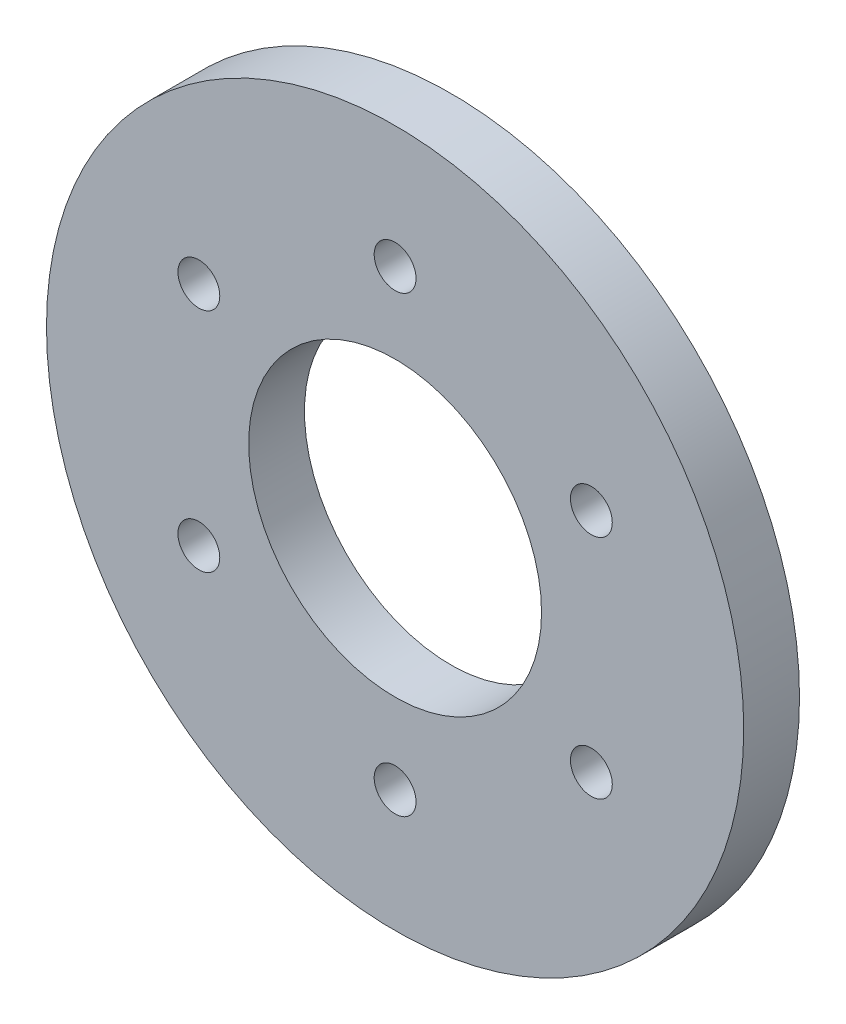
ISO-10303-21;
HEADER;
FILE_DESCRIPTION(('STEP AP214'),'2;1');
FILE_NAME('part.step','',(''),(''),'','','');
FILE_SCHEMA(('AUTOMOTIVE_DESIGN { 1 0 10303 214 1 1 1 1 }'));
ENDSEC;
DATA;
#1=APPLICATION_CONTEXT('core data for automotive mechanical design processes');
#2=APPLICATION_PROTOCOL_DEFINITION('international standard','automotive_design',2000,#1);
#3=PRODUCT_CONTEXT('',#1,'mechanical');
#4=PRODUCT('Part','Part','',(#3));
#5=PRODUCT_RELATED_PRODUCT_CATEGORY('part','',(#4));
#6=PRODUCT_DEFINITION_FORMATION('','',#4);
#7=PRODUCT_DEFINITION_CONTEXT('part definition',#1,'design');
#8=PRODUCT_DEFINITION('design','',#6,#7);
#9=PRODUCT_DEFINITION_SHAPE('','',#8);
#10=(LENGTH_UNIT() NAMED_UNIT(*) SI_UNIT(.MILLI.,.METRE.));
#11=(NAMED_UNIT(*) PLANE_ANGLE_UNIT() SI_UNIT($,.RADIAN.));
#12=(NAMED_UNIT(*) SI_UNIT($,.STERADIAN.) SOLID_ANGLE_UNIT());
#13=UNCERTAINTY_MEASURE_WITH_UNIT(LENGTH_MEASURE(1.E-05),#10,'distance_accuracy_value','');
#14=(GEOMETRIC_REPRESENTATION_CONTEXT(3) GLOBAL_UNCERTAINTY_ASSIGNED_CONTEXT((#13)) GLOBAL_UNIT_ASSIGNED_CONTEXT((#10,
#11,#12)) REPRESENTATION_CONTEXT('',''));
#15=CARTESIAN_POINT('',(0.,0.,0.));
#16=DIRECTION('',(0.,0.,1.));
#17=DIRECTION('',(1.,0.,0.));
#18=AXIS2_PLACEMENT_3D('',#15,#16,#17);
#19=CARTESIAN_POINT('',(-80.8551645809938,39.5101937964285,-40.9999899999918));
#20=DIRECTION('',(0.,0.,1.));
#21=DIRECTION('',(1.,0.,0.));
#22=AXIS2_PLACEMENT_3D('',#19,#20,#21);
#23=PLANE('',#22);
#24=CARTESIAN_POINT('',(-109.000990203987,23.260193796428,-40.9999899999918));
#25=DIRECTION('',(0.,0.,1.));
#26=DIRECTION('',(1.,0.,0.));
#27=AXIS2_PLACEMENT_3D('',#24,#25,#26);
#28=CIRCLE('',#27,3.00000000000001);
#29=CARTESIAN_POINT('',(-106.000990203987,23.260193796428,-40.9999899999918));
#30=VERTEX_POINT('',#29);
#31=EDGE_CURVE('E71',#30,#30,#28,.T.);
#32=ORIENTED_EDGE('',*,*,#31,.F.);
#33=EDGE_LOOP('',(#32));
#34=FACE_BOUND('',#33,.T.);
#35=CARTESIAN_POINT('',(-52.7093389579982,23.2601937964292,-40.9999899999918));
#36=DIRECTION('',(0.,0.,1.));
#37=DIRECTION('',(1.,0.,0.));
#38=AXIS2_PLACEMENT_3D('',#35,#36,#37);
#39=CIRCLE('',#38,3.);
#40=CARTESIAN_POINT('',(-49.7093389579982,23.2601937964292,-40.9999899999918));
#41=VERTEX_POINT('',#40);
#42=EDGE_CURVE('E59',#41,#41,#39,.T.);
#43=ORIENTED_EDGE('',*,*,#42,.F.);
#44=EDGE_LOOP('',(#43));
#45=FACE_BOUND('',#44,.T.);
#46=CARTESIAN_POINT('',(-80.8551645809938,72.0101937964285,-40.9999899999918));
#47=DIRECTION('',(0.,0.,1.));
#48=DIRECTION('',(1.,0.,0.));
#49=AXIS2_PLACEMENT_3D('',#46,#47,#48);
#50=CIRCLE('',#49,3.00000000000001);
#51=CARTESIAN_POINT('',(-77.8551645809938,72.0101937964285,-40.9999899999918));
#52=VERTEX_POINT('',#51);
#53=EDGE_CURVE('E47',#52,#52,#50,.T.);
#54=ORIENTED_EDGE('',*,*,#53,.F.);
#55=EDGE_LOOP('',(#54));
#56=FACE_BOUND('',#55,.T.);
#57=CARTESIAN_POINT('',(-80.8551645809938,39.5101937964285,-40.9999899999918));
#58=DIRECTION('',(0.,0.,1.));
#59=DIRECTION('',(1.,0.,0.));
#60=AXIS2_PLACEMENT_3D('',#57,#58,#59);
#61=CIRCLE('',#60,50.);
#62=CARTESIAN_POINT('',(-30.8551645809938,39.5101937964285,-40.9999899999918));
#63=VERTEX_POINT('',#62);
#64=EDGE_CURVE('E10',#63,#63,#61,.T.);
#65=ORIENTED_EDGE('',*,*,#64,.T.);
#66=EDGE_LOOP('',(#65));
#67=FACE_BOUND('',#66,.T.);
#68=CARTESIAN_POINT('',(-80.8551645809938,39.5101937964285,-40.9999899999918));
#69=DIRECTION('',(0.,0.,1.));
#70=DIRECTION('',(1.,0.,0.));
#71=AXIS2_PLACEMENT_3D('',#68,#69,#70);
#72=CIRCLE('',#71,20.9999999999854);
#73=CARTESIAN_POINT('',(-59.8551645810084,39.5101937964285,-40.9999899999918));
#74=VERTEX_POINT('',#73);
#75=EDGE_CURVE('E42',#74,#74,#72,.T.);
#76=ORIENTED_EDGE('',*,*,#75,.F.);
#77=EDGE_LOOP('',(#76));
#78=FACE_BOUND('',#77,.T.);
#79=CARTESIAN_POINT('',(-52.709338957999,55.7601937964292,-40.9999899999918));
#80=DIRECTION('',(0.,0.,1.));
#81=DIRECTION('',(1.,0.,0.));
#82=AXIS2_PLACEMENT_3D('',#79,#80,#81);
#83=CIRCLE('',#82,3.);
#84=CARTESIAN_POINT('',(-49.709338957999,55.7601937964292,-40.9999899999918));
#85=VERTEX_POINT('',#84);
#86=EDGE_CURVE('E53',#85,#85,#83,.T.);
#87=ORIENTED_EDGE('',*,*,#86,.F.);
#88=EDGE_LOOP('',(#87));
#89=FACE_BOUND('',#88,.T.);
#90=CARTESIAN_POINT('',(-80.8551645809922,7.0101937964285,-40.9999899999918));
#91=DIRECTION('',(0.,0.,1.));
#92=DIRECTION('',(1.,0.,0.));
#93=AXIS2_PLACEMENT_3D('',#90,#91,#92);
#94=CIRCLE('',#93,3.00000000000001);
#95=CARTESIAN_POINT('',(-77.8551645809922,7.0101937964285,-40.9999899999918));
#96=VERTEX_POINT('',#95);
#97=EDGE_CURVE('E65',#96,#96,#94,.T.);
#98=ORIENTED_EDGE('',*,*,#97,.F.);
#99=EDGE_LOOP('',(#98));
#100=FACE_BOUND('',#99,.T.);
#101=CARTESIAN_POINT('',(-109.000990203987,55.7601937964281,-40.9999899999918));
#102=DIRECTION('',(0.,0.,1.));
#103=DIRECTION('',(1.,0.,0.));
#104=AXIS2_PLACEMENT_3D('',#101,#102,#103);
#105=CIRCLE('',#104,3.00000000000001);
#106=CARTESIAN_POINT('',(-106.000990203987,55.7601937964281,-40.9999899999918));
#107=VERTEX_POINT('',#106);
#108=EDGE_CURVE('E77',#107,#107,#105,.T.);
#109=ORIENTED_EDGE('',*,*,#108,.F.);
#110=EDGE_LOOP('',(#109));
#111=FACE_BOUND('',#110,.T.);
#112=ADVANCED_FACE('F31',(#34,#45,#56,#67,#78,#89,#100,#111),#23,.T.);
#113=CARTESIAN_POINT('',(-80.8551645809938,39.5101937964285,-48.9999899999918));
#114=DIRECTION('',(0.,0.,1.));
#115=DIRECTION('',(1.,0.,0.));
#116=AXIS2_PLACEMENT_3D('',#113,#114,#115);
#117=PLANE('',#116);
#118=CARTESIAN_POINT('',(-80.8551645809938,39.5101937964285,-48.9999899999918));
#119=DIRECTION('',(0.,0.,1.));
#120=DIRECTION('',(1.,0.,0.));
#121=AXIS2_PLACEMENT_3D('',#118,#119,#120);
#122=CIRCLE('',#121,50.);
#123=CARTESIAN_POINT('',(-30.8551645809938,39.5101937964285,-48.9999899999918));
#124=VERTEX_POINT('',#123);
#125=EDGE_CURVE('E35',#124,#124,#122,.T.);
#126=ORIENTED_EDGE('',*,*,#125,.F.);
#127=EDGE_LOOP('',(#126));
#128=FACE_BOUND('',#127,.T.);
#129=CARTESIAN_POINT('',(-80.8551645809938,39.5101937964285,-48.9999899999918));
#130=DIRECTION('',(0.,0.,1.));
#131=DIRECTION('',(1.,0.,0.));
#132=AXIS2_PLACEMENT_3D('',#129,#130,#131);
#133=CIRCLE('',#132,20.9999999999854);
#134=CARTESIAN_POINT('',(-59.8551645810084,39.5101937964285,-48.9999899999918));
#135=VERTEX_POINT('',#134);
#136=EDGE_CURVE('E44',#135,#135,#133,.T.);
#137=ORIENTED_EDGE('',*,*,#136,.T.);
#138=EDGE_LOOP('',(#137));
#139=FACE_BOUND('',#138,.T.);
#140=CARTESIAN_POINT('',(-80.8551645809938,72.0101937964285,-48.9999899999918));
#141=DIRECTION('',(0.,0.,1.));
#142=DIRECTION('',(1.,0.,0.));
#143=AXIS2_PLACEMENT_3D('',#140,#141,#142);
#144=CIRCLE('',#143,3.00000000000001);
#145=CARTESIAN_POINT('',(-77.8551645809938,72.0101937964285,-48.9999899999918));
#146=VERTEX_POINT('',#145);
#147=EDGE_CURVE('E50',#146,#146,#144,.T.);
#148=ORIENTED_EDGE('',*,*,#147,.T.);
#149=EDGE_LOOP('',(#148));
#150=FACE_BOUND('',#149,.T.);
#151=CARTESIAN_POINT('',(-52.709338957999,55.7601937964292,-48.9999899999918));
#152=DIRECTION('',(0.,0.,1.));
#153=DIRECTION('',(1.,0.,0.));
#154=AXIS2_PLACEMENT_3D('',#151,#152,#153);
#155=CIRCLE('',#154,3.);
#156=CARTESIAN_POINT('',(-49.709338957999,55.7601937964292,-48.9999899999918));
#157=VERTEX_POINT('',#156);
#158=EDGE_CURVE('E56',#157,#157,#155,.T.);
#159=ORIENTED_EDGE('',*,*,#158,.T.);
#160=EDGE_LOOP('',(#159));
#161=FACE_BOUND('',#160,.T.);
#162=CARTESIAN_POINT('',(-52.7093389579982,23.2601937964292,-48.9999899999918));
#163=DIRECTION('',(0.,0.,1.));
#164=DIRECTION('',(1.,0.,0.));
#165=AXIS2_PLACEMENT_3D('',#162,#163,#164);
#166=CIRCLE('',#165,3.);
#167=CARTESIAN_POINT('',(-49.7093389579982,23.2601937964292,-48.9999899999918));
#168=VERTEX_POINT('',#167);
#169=EDGE_CURVE('E62',#168,#168,#166,.T.);
#170=ORIENTED_EDGE('',*,*,#169,.T.);
#171=EDGE_LOOP('',(#170));
#172=FACE_BOUND('',#171,.T.);
#173=CARTESIAN_POINT('',(-80.8551645809922,7.0101937964285,-48.9999899999918));
#174=DIRECTION('',(0.,0.,1.));
#175=DIRECTION('',(1.,0.,0.));
#176=AXIS2_PLACEMENT_3D('',#173,#174,#175);
#177=CIRCLE('',#176,3.00000000000001);
#178=CARTESIAN_POINT('',(-77.8551645809922,7.0101937964285,-48.9999899999918));
#179=VERTEX_POINT('',#178);
#180=EDGE_CURVE('E68',#179,#179,#177,.T.);
#181=ORIENTED_EDGE('',*,*,#180,.T.);
#182=EDGE_LOOP('',(#181));
#183=FACE_BOUND('',#182,.T.);
#184=CARTESIAN_POINT('',(-109.000990203987,23.260193796428,-48.9999899999918));
#185=DIRECTION('',(0.,0.,1.));
#186=DIRECTION('',(1.,0.,0.));
#187=AXIS2_PLACEMENT_3D('',#184,#185,#186);
#188=CIRCLE('',#187,3.00000000000001);
#189=CARTESIAN_POINT('',(-106.000990203987,23.260193796428,-48.9999899999918));
#190=VERTEX_POINT('',#189);
#191=EDGE_CURVE('E74',#190,#190,#188,.T.);
#192=ORIENTED_EDGE('',*,*,#191,.T.);
#193=EDGE_LOOP('',(#192));
#194=FACE_BOUND('',#193,.T.);
#195=CARTESIAN_POINT('',(-109.000990203987,55.7601937964281,-48.9999899999918));
#196=DIRECTION('',(0.,0.,1.));
#197=DIRECTION('',(1.,0.,0.));
#198=AXIS2_PLACEMENT_3D('',#195,#196,#197);
#199=CIRCLE('',#198,3.00000000000001);
#200=CARTESIAN_POINT('',(-106.000990203987,55.7601937964281,-48.9999899999918));
#201=VERTEX_POINT('',#200);
#202=EDGE_CURVE('E80',#201,#201,#199,.T.);
#203=ORIENTED_EDGE('',*,*,#202,.T.);
#204=EDGE_LOOP('',(#203));
#205=FACE_BOUND('',#204,.T.);
#206=ADVANCED_FACE('F90',(#128,#139,#150,#161,#172,#183,#194,#205),#117,.F.);
#207=CARTESIAN_POINT('',(-80.8551645809938,39.5101937964285,-40.9999899999918));
#208=DIRECTION('',(0.,0.,-1.));
#209=DIRECTION('',(-1.,0.,0.));
#210=AXIS2_PLACEMENT_3D('',#207,#208,#209);
#211=CYLINDRICAL_SURFACE('',#210,50.);
#212=ORIENTED_EDGE('',*,*,#64,.F.);
#213=EDGE_LOOP('',(#212));
#214=FACE_BOUND('',#213,.T.);
#215=ORIENTED_EDGE('',*,*,#125,.T.);
#216=EDGE_LOOP('',(#215));
#217=FACE_BOUND('',#216,.T.);
#218=ADVANCED_FACE('F33',(#214,#217),#211,.T.);
#219=CARTESIAN_POINT('',(-80.8551645809938,39.5101937964285,-40.9999899999918));
#220=DIRECTION('',(0.,0.,-1.));
#221=DIRECTION('',(-1.,0.,0.));
#222=AXIS2_PLACEMENT_3D('',#219,#220,#221);
#223=CYLINDRICAL_SURFACE('',#222,20.9999999999854);
#224=ORIENTED_EDGE('',*,*,#75,.T.);
#225=EDGE_LOOP('',(#224));
#226=FACE_BOUND('',#225,.T.);
#227=ORIENTED_EDGE('',*,*,#136,.F.);
#228=EDGE_LOOP('',(#227));
#229=FACE_BOUND('',#228,.T.);
#230=ADVANCED_FACE('F100',(#226,#229),#223,.F.);
#231=CARTESIAN_POINT('',(-80.8551645809938,72.0101937964285,-40.9999899999918));
#232=DIRECTION('',(0.,0.,-1.));
#233=DIRECTION('',(-1.,0.,0.));
#234=AXIS2_PLACEMENT_3D('',#231,#232,#233);
#235=CYLINDRICAL_SURFACE('',#234,3.00000000000001);
#236=ORIENTED_EDGE('',*,*,#53,.T.);
#237=EDGE_LOOP('',(#236));
#238=FACE_BOUND('',#237,.T.);
#239=ORIENTED_EDGE('',*,*,#147,.F.);
#240=EDGE_LOOP('',(#239));
#241=FACE_BOUND('',#240,.T.);
#242=ADVANCED_FACE('F103',(#238,#241),#235,.F.);
#243=CARTESIAN_POINT('',(-52.709338957999,55.7601937964292,-40.9999899999918));
#244=DIRECTION('',(0.,0.,-1.));
#245=DIRECTION('',(-1.,0.,0.));
#246=AXIS2_PLACEMENT_3D('',#243,#244,#245);
#247=CYLINDRICAL_SURFACE('',#246,3.);
#248=ORIENTED_EDGE('',*,*,#86,.T.);
#249=EDGE_LOOP('',(#248));
#250=FACE_BOUND('',#249,.T.);
#251=ORIENTED_EDGE('',*,*,#158,.F.);
#252=EDGE_LOOP('',(#251));
#253=FACE_BOUND('',#252,.T.);
#254=ADVANCED_FACE('F107',(#250,#253),#247,.F.);
#255=CARTESIAN_POINT('',(-52.7093389579982,23.2601937964292,-40.9999899999918));
#256=DIRECTION('',(0.,0.,-1.));
#257=DIRECTION('',(-1.,0.,0.));
#258=AXIS2_PLACEMENT_3D('',#255,#256,#257);
#259=CYLINDRICAL_SURFACE('',#258,3.);
#260=ORIENTED_EDGE('',*,*,#42,.T.);
#261=EDGE_LOOP('',(#260));
#262=FACE_BOUND('',#261,.T.);
#263=ORIENTED_EDGE('',*,*,#169,.F.);
#264=EDGE_LOOP('',(#263));
#265=FACE_BOUND('',#264,.T.);
#266=ADVANCED_FACE('F111',(#262,#265),#259,.F.);
#267=CARTESIAN_POINT('',(-80.8551645809922,7.0101937964285,-40.9999899999918));
#268=DIRECTION('',(0.,0.,-1.));
#269=DIRECTION('',(-1.,0.,0.));
#270=AXIS2_PLACEMENT_3D('',#267,#268,#269);
#271=CYLINDRICAL_SURFACE('',#270,3.00000000000001);
#272=ORIENTED_EDGE('',*,*,#97,.T.);
#273=EDGE_LOOP('',(#272));
#274=FACE_BOUND('',#273,.T.);
#275=ORIENTED_EDGE('',*,*,#180,.F.);
#276=EDGE_LOOP('',(#275));
#277=FACE_BOUND('',#276,.T.);
#278=ADVANCED_FACE('F115',(#274,#277),#271,.F.);
#279=CARTESIAN_POINT('',(-109.000990203987,23.260193796428,-40.9999899999918));
#280=DIRECTION('',(0.,0.,-1.));
#281=DIRECTION('',(-1.,0.,0.));
#282=AXIS2_PLACEMENT_3D('',#279,#280,#281);
#283=CYLINDRICAL_SURFACE('',#282,3.00000000000001);
#284=ORIENTED_EDGE('',*,*,#31,.T.);
#285=EDGE_LOOP('',(#284));
#286=FACE_BOUND('',#285,.T.);
#287=ORIENTED_EDGE('',*,*,#191,.F.);
#288=EDGE_LOOP('',(#287));
#289=FACE_BOUND('',#288,.T.);
#290=ADVANCED_FACE('F119',(#286,#289),#283,.F.);
#291=CARTESIAN_POINT('',(-109.000990203987,55.7601937964281,-40.9999899999918));
#292=DIRECTION('',(0.,0.,-1.));
#293=DIRECTION('',(-1.,0.,0.));
#294=AXIS2_PLACEMENT_3D('',#291,#292,#293);
#295=CYLINDRICAL_SURFACE('',#294,3.00000000000001);
#296=ORIENTED_EDGE('',*,*,#108,.T.);
#297=EDGE_LOOP('',(#296));
#298=FACE_BOUND('',#297,.T.);
#299=ORIENTED_EDGE('',*,*,#202,.F.);
#300=EDGE_LOOP('',(#299));
#301=FACE_BOUND('',#300,.T.);
#302=ADVANCED_FACE('F86',(#298,#301),#295,.F.);
#303=CLOSED_SHELL('',(#112,#206,#218,#230,#242,#254,#266,#278,#290,#302));
#304=MANIFOLD_SOLID_BREP('B2',#303);
#305=ADVANCED_BREP_SHAPE_REPRESENTATION('',(#18,#304),#14);
#306=SHAPE_DEFINITION_REPRESENTATION(#9,#305);
ENDSEC;
END-ISO-10303-21;
